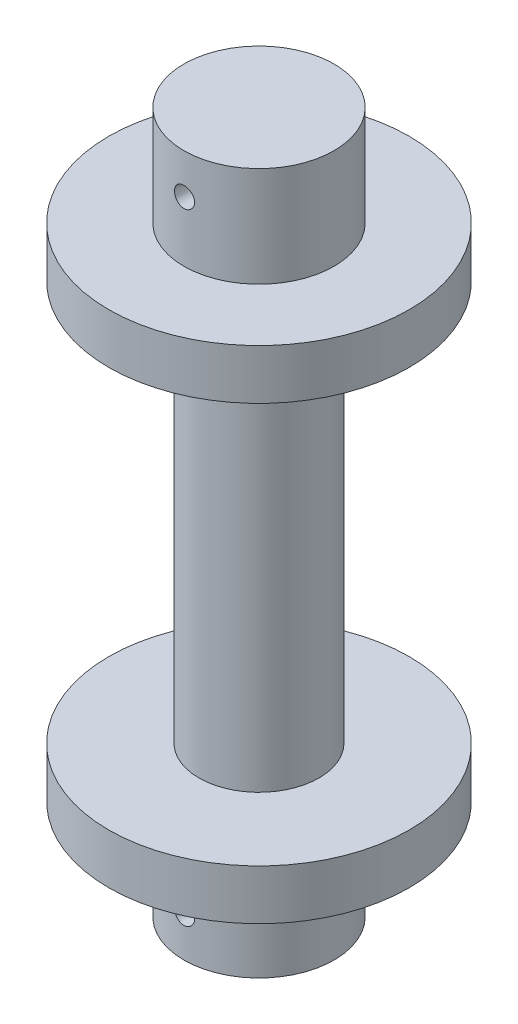
ISO-10303-21;
HEADER;
FILE_DESCRIPTION(('STEP AP214'),'2;1');
FILE_NAME('part.step','',(''),(''),'','','');
FILE_SCHEMA(('AUTOMOTIVE_DESIGN { 1 0 10303 214 1 1 1 1 }'));
ENDSEC;
DATA;
#1=APPLICATION_CONTEXT('core data for automotive mechanical design processes');
#2=APPLICATION_PROTOCOL_DEFINITION('international standard','automotive_design',2000,#1);
#3=PRODUCT_CONTEXT('',#1,'mechanical');
#4=PRODUCT('Part','Part','',(#3));
#5=PRODUCT_RELATED_PRODUCT_CATEGORY('part','',(#4));
#6=PRODUCT_DEFINITION_FORMATION('','',#4);
#7=PRODUCT_DEFINITION_CONTEXT('part definition',#1,'design');
#8=PRODUCT_DEFINITION('design','',#6,#7);
#9=PRODUCT_DEFINITION_SHAPE('','',#8);
#10=(LENGTH_UNIT() NAMED_UNIT(*) SI_UNIT(.MILLI.,.METRE.));
#11=(NAMED_UNIT(*) PLANE_ANGLE_UNIT() SI_UNIT($,.RADIAN.));
#12=(NAMED_UNIT(*) SI_UNIT($,.STERADIAN.) SOLID_ANGLE_UNIT());
#13=UNCERTAINTY_MEASURE_WITH_UNIT(LENGTH_MEASURE(1.E-05),#10,'distance_accuracy_value','');
#14=(GEOMETRIC_REPRESENTATION_CONTEXT(3) GLOBAL_UNCERTAINTY_ASSIGNED_CONTEXT((#13)) GLOBAL_UNIT_ASSIGNED_CONTEXT((#10,
#11,#12)) REPRESENTATION_CONTEXT('',''));
#15=CARTESIAN_POINT('',(0.,0.,0.));
#16=DIRECTION('',(0.,0.,1.));
#17=DIRECTION('',(1.,0.,0.));
#18=AXIS2_PLACEMENT_3D('',#15,#16,#17);
#19=CARTESIAN_POINT('',(0.,10.,0.));
#20=DIRECTION('',(0.,-1.,0.));
#21=DIRECTION('',(0.,0.,-1.));
#22=AXIS2_PLACEMENT_3D('',#19,#20,#21);
#23=CYLINDRICAL_SURFACE('',#22,7.5);
#24=CARTESIAN_POINT('',(0.,5.,-7.5));
#25=CARTESIAN_POINT('',(-0.0559044178346422,4.99999764514654,-7.49999917871272));
#26=CARTESIAN_POINT('',(-0.11184298963814,4.99529623101876,-7.49936835363597));
#27=CARTESIAN_POINT('',(-0.222161362569039,4.97661682547522,-7.49691255563452));
#28=CARTESIAN_POINT('',(-0.276539511166518,4.96262935255143,-7.49508636220862));
#29=CARTESIAN_POINT('',(-0.382124156313492,4.92579914122928,-7.49044539924533));
#30=CARTESIAN_POINT('',(-0.433332841529247,4.90296259448078,-7.48763132105486));
#31=CARTESIAN_POINT('',(-0.53118194751515,4.84909654309686,-7.48132693330196));
#32=CARTESIAN_POINT('',(-0.577823103168513,4.81806835941677,-7.47783673279283));
#33=CARTESIAN_POINT('',(-0.665512911252339,4.74849336919791,-7.47054497394982));
#34=CARTESIAN_POINT('',(-0.706528992747931,4.70990567749576,-7.46674179081055));
#35=CARTESIAN_POINT('',(-0.781523678365509,4.62639490546167,-7.45926568778975));
#36=CARTESIAN_POINT('',(-0.815501909986106,4.5814714900021,-7.45559277481171));
#37=CARTESIAN_POINT('',(-0.875579511344537,4.48635043852748,-7.44877717720095));
#38=CARTESIAN_POINT('',(-0.901648037412889,4.43613315876069,-7.44563658882881));
#39=CARTESIAN_POINT('',(-0.944969225036451,4.33198446638161,-7.44026293689616));
#40=CARTESIAN_POINT('',(-0.96222226622639,4.27805321382334,-7.43802983425604));
#41=CARTESIAN_POINT('',(-0.987323033860869,4.16834709474917,-7.43473968284334));
#42=CARTESIAN_POINT('',(-0.995226021142532,4.11258508273354,-7.43367572685068));
#43=CARTESIAN_POINT('',(-1.00157340274059,4.00051691019702,-7.43282325804657));
#44=CARTESIAN_POINT('',(-1.00001822816801,3.94421077459455,-7.433034687102));
#45=CARTESIAN_POINT('',(-0.987538729696172,3.83303943498604,-7.43470277886495));
#46=CARTESIAN_POINT('',(-0.976675487658808,3.77816723505715,-7.43615132311171));
#47=CARTESIAN_POINT('',(-0.945983623171857,3.67103158161996,-7.44011776387373));
#48=CARTESIAN_POINT('',(-0.926154796307286,3.61876818762249,-7.44263568477064));
#49=CARTESIAN_POINT('',(-0.878029645715955,3.5181451826464,-7.44846630555513));
#50=CARTESIAN_POINT('',(-0.849706989568746,3.46979831440285,-7.45178147061949));
#51=CARTESIAN_POINT('',(-0.785416966721446,3.37852045904117,-7.45883118109967));
#52=CARTESIAN_POINT('',(-0.749449202511925,3.33558975372292,-7.46256574831765));
#53=CARTESIAN_POINT('',(-0.670552450131812,3.25600849370905,-7.47006949616793));
#54=CARTESIAN_POINT('',(-0.627570853513223,3.21941007864884,-7.47383871770599));
#55=CARTESIAN_POINT('',(-0.536047085066704,3.15393897753581,-7.48095961909132));
#56=CARTESIAN_POINT('',(-0.487504897221185,3.12506631373824,-7.48431129773577));
#57=CARTESIAN_POINT('',(-0.386196109865235,3.07586544115263,-7.4902219687179));
#58=CARTESIAN_POINT('',(-0.333427789420615,3.05554073447684,-7.49278063604478));
#59=CARTESIAN_POINT('',(-0.225185462168125,3.02405534051383,-7.49681412952036));
#60=CARTESIAN_POINT('',(-0.169711599771129,3.0128941646803,-7.49828901344964));
#61=CARTESIAN_POINT('',(-0.0580834516628221,3.00012078361444,-7.49998120688428));
#62=CARTESIAN_POINT('',(-0.00193751727352132,2.99843679910826,-7.50020796924523));
#63=CARTESIAN_POINT('',(0.109835808609359,3.00447583206359,-7.49940395769259));
#64=CARTESIAN_POINT('',(0.165463212672832,3.01219862089118,-7.498373214343));
#65=CARTESIAN_POINT('',(0.274406857786469,3.03677232669199,-7.49517587679051));
#66=CARTESIAN_POINT('',(0.327731008256022,3.05358878416107,-7.49301357151461));
#67=CARTESIAN_POINT('',(0.43080254939678,3.09583648296854,-7.48779504627144));
#68=CARTESIAN_POINT('',(0.480549803507819,3.12126805300663,-7.4847387921972));
#69=CARTESIAN_POINT('',(0.575374439308039,3.18019607779166,-7.47804918685037));
#70=CARTESIAN_POINT('',(0.620422907198301,3.21373868285667,-7.47441257522858));
#71=CARTESIAN_POINT('',(0.704276473495948,3.28787166461213,-7.46697864354991));
#72=CARTESIAN_POINT('',(0.743081288311892,3.32846236125822,-7.4631813162031));
#73=CARTESIAN_POINT('',(0.81360274711549,3.41585657131978,-7.45582451236755));
#74=CARTESIAN_POINT('',(0.845271638044691,3.46269878336908,-7.45226674387649));
#75=CARTESIAN_POINT('',(0.900291755394069,3.56107970514046,-7.44582066500909));
#76=CARTESIAN_POINT('',(0.923643167551732,3.61261830995519,-7.44293233968392));
#77=CARTESIAN_POINT('',(0.961289182503731,3.71877862101385,-7.43816405890039));
#78=CARTESIAN_POINT('',(0.975610144233977,3.7733908426054,-7.43628117116299));
#79=CARTESIAN_POINT('',(0.994873335719794,3.88427181606438,-7.43372874349146));
#80=CARTESIAN_POINT('',(0.999816067133909,3.94054047916222,-7.43305913865671));
#81=CARTESIAN_POINT('',(1.00017242903095,4.05266174542675,-7.43301115647724));
#82=CARTESIAN_POINT('',(0.995661095972463,4.10851412048212,-7.4336226114126));
#83=CARTESIAN_POINT('',(0.977396883433446,4.21865893755194,-7.43604591937099));
#84=CARTESIAN_POINT('',(0.963644007416343,4.27295138015099,-7.43785777194415));
#85=CARTESIAN_POINT('',(0.927311551661036,4.37842184162579,-7.44247445136382));
#86=CARTESIAN_POINT('',(0.904736104095206,4.42960130555843,-7.445278813297));
#87=CARTESIAN_POINT('',(0.851406713798686,4.52745794191303,-7.45156522856411));
#88=CARTESIAN_POINT('',(0.820652613152143,4.57413502737802,-7.45504729498301));
#89=CARTESIAN_POINT('',(0.751562242547542,4.6620448249642,-7.46232983591531));
#90=CARTESIAN_POINT('',(0.713170136134505,4.70323347387756,-7.46613252877041));
#91=CARTESIAN_POINT('',(0.630010846749118,4.77861160818077,-7.47360859500832));
#92=CARTESIAN_POINT('',(0.585242170364888,4.81279944937512,-7.47728193784489));
#93=CARTESIAN_POINT('',(0.490376493926411,4.87333356923326,-7.48410317568764));
#94=CARTESIAN_POINT('',(0.440257310371983,4.89964533327762,-7.48724873213445));
#95=CARTESIAN_POINT('',(0.336296204793665,4.94344029927254,-7.49263660329486));
#96=CARTESIAN_POINT('',(0.282458339484945,4.96093295431243,-7.49487988462156));
#97=CARTESIAN_POINT('',(0.19029420404921,4.98247400319259,-7.49767860871633));
#98=CARTESIAN_POINT('',(0.15254554097789,4.98903662176182,-7.49854481817537));
#99=CARTESIAN_POINT('',(0.0765365858080562,4.99780040708274,-7.49970579245385));
#100=CARTESIAN_POINT('',(0.0382762982256203,5.0000016123068,-7.500000562314));
#101=CARTESIAN_POINT('',(0.,5.,-7.5));
#102=B_SPLINE_CURVE_WITH_KNOTS('',3,(#24,#25,#26,#27,#28,#29,#30,#31,#32,#33,#34,#35,#36,#37,
#38,#39,#40,#41,#42,#43,#44,#45,#46,#47,#48,#49,#50,#51,#52,#53,#54,#55,#56,#57,#58,#59,#60,#61,
#62,#63,#64,#65,#66,#67,#68,#69,#70,#71,#72,#73,#74,#75,#76,#77,#78,#79,#80,#81,#82,#83,#84,#85,
#86,#87,#88,#89,#90,#91,#92,#93,#94,#95,#96,#97,#98,#99,#100,#101),.UNSPECIFIED.,.T.,.F.,(4,2,2,
2,2,2,2,2,2,2,2,2,2,2,2,2,2,2,2,2,2,2,2,2,2,2,2,2,2,2,2,2,2,2,2,2,2,2,4),(0.,0.167573425652872,
0.335318215442522,0.502945846413703,0.670546462820173,0.839079892217795,1.00762223952418,
1.17681360755824,1.34599768883102,1.51417677957179,1.6823482046246,1.84942442549022,
2.01650445587925,2.18410791568949,2.35172009221899,2.52065272242425,2.68958583926148,
2.85858810101269,3.02758135195871,3.1952929249603,3.36300042177239,3.53007681698232,
3.69715958751773,3.86521637384942,4.03328079129381,4.20243852267725,4.37159247636524,
4.54025037367727,4.70889924891817,4.87621463748312,5.04352996334373,5.2107670185131,
5.37800730297951,5.54651833917553,5.7150689062558,5.88434763337258,6.05344452496209,
6.16817869523654,6.28291185342719),.UNSPECIFIED.);
#103=CARTESIAN_POINT('',(0.,5.,-7.5));
#104=VERTEX_POINT('',#103);
#105=EDGE_CURVE('E44',#104,#104,#102,.T.);
#106=ORIENTED_EDGE('',*,*,#105,.T.);
#107=EDGE_LOOP('',(#106));
#108=FACE_BOUND('',#107,.T.);
#109=CARTESIAN_POINT('',(1.,4.,7.43303437365925));
#110=CARTESIAN_POINT('',(0.999997642974211,3.94409807226988,7.43303522266631));
#111=CARTESIAN_POINT('',(0.995296633522848,3.88816198345359,7.43367182371829));
#112=CARTESIAN_POINT('',(0.976618981332774,3.77784876884303,7.43614824351763));
#113=CARTESIAN_POINT('',(0.962632848245786,3.72347329754358,7.43798929330704));
#114=CARTESIAN_POINT('',(0.925806555700513,3.61789431588298,7.44266246058434));
#115=CARTESIAN_POINT('',(0.902972651375006,3.56668859419012,7.4454938777722));
#116=CARTESIAN_POINT('',(0.849112824403648,3.46884446214626,7.45182791129731));
#117=CARTESIAN_POINT('',(0.818088216317403,3.42220532053126,7.45533041990363));
#118=CARTESIAN_POINT('',(0.74851685244753,3.33451327266549,7.46263688659337));
#119=CARTESIAN_POINT('',(0.709928411374281,3.29349356716023,7.4664424424659));
#120=CARTESIAN_POINT('',(0.626414614363067,3.21849187727188,7.47391188129393));
#121=CARTESIAN_POINT('',(0.581488933235995,3.18451025426192,7.47757575696696));
#122=CARTESIAN_POINT('',(0.486365862463802,3.12442907914178,7.48436549880109));
#123=CARTESIAN_POINT('',(0.43614921885561,3.09835975535487,7.48748928251119));
#124=CARTESIAN_POINT('',(0.332001908018684,3.0550369179096,7.49282926707925));
#125=CARTESIAN_POINT('',(0.2780713969612,3.03778303381116,7.49504550607303));
#126=CARTESIAN_POINT('',(0.168367687507044,3.01268054520987,7.49830943097799));
#127=CARTESIAN_POINT('',(0.112607361734948,3.00477659249402,7.49936399102537));
#128=CARTESIAN_POINT('',(0.000542501151828074,2.99842669563159,7.5002092398576));
#129=CARTESIAN_POINT('',(-0.0557620093612332,2.99998033113174,7.49999998481415));
#130=CARTESIAN_POINT('',(-0.166940062232885,3.01245736527047,7.49834672058453));
#131=CARTESIAN_POINT('',(-0.221820418680892,3.02332123237282,7.49691055668904));
#132=CARTESIAN_POINT('',(-0.328972061356277,3.05401716351075,7.49297362046144));
#133=CARTESIAN_POINT('',(-0.38124329227092,3.07384941758406,7.49047282557017));
#134=CARTESIAN_POINT('',(-0.481875904212064,3.12198172056091,7.48467409502082));
#135=CARTESIAN_POINT('',(-0.53022492467663,3.15030731159154,7.48137376072939));
#136=CARTESIAN_POINT('',(-0.621505845367393,3.21460362864143,7.4743447520952));
#137=CARTESIAN_POINT('',(-0.664437462933408,3.2505747533139,7.47061605542144));
#138=CARTESIAN_POINT('',(-0.744015030772694,3.32947392417947,7.46311294047831));
#139=CARTESIAN_POINT('',(-0.780609516765106,3.37245388409682,7.459338392122));
#140=CARTESIAN_POINT('',(-0.846073465285955,3.46397296568629,7.45219749384619));
#141=CARTESIAN_POINT('',(-0.874942897181765,3.51251210940148,7.44883114554537));
#142=CARTESIAN_POINT('',(-0.9241414304325,3.61382000017335,7.4428878816717));
#143=CARTESIAN_POINT('',(-0.944466044533533,3.66659095225924,7.44031138107393));
#144=CARTESIAN_POINT('',(-0.97595045022462,3.77483901031919,7.43624737732859));
#145=CARTESIAN_POINT('',(-0.987110746770717,3.83031596701328,7.43475981418081));
#146=CARTESIAN_POINT('',(-0.999880803843635,3.94194566750248,7.43305322505173));
#147=CARTESIAN_POINT('',(-1.00156315549406,3.99808996516627,7.43282455755814));
#148=CARTESIAN_POINT('',(-0.995521440943979,4.10985962805237,7.43363612148349));
#149=CARTESIAN_POINT('',(-0.987797603648882,4.16548500586973,7.43467632202375));
#150=CARTESIAN_POINT('',(-0.963224025185098,4.27441799320281,7.43789960218385));
#151=CARTESIAN_POINT('',(-0.946409751616799,4.32773374650905,7.44007823893825));
#152=CARTESIAN_POINT('',(-0.904169225400626,4.43078945672622,7.44532929507204));
#153=CARTESIAN_POINT('',(-0.878742631046915,4.48052927166186,7.44840174991421));
#154=CARTESIAN_POINT('',(-0.819822032086054,4.57534865522041,7.45511723309759));
#155=CARTESIAN_POINT('',(-0.786280615831502,4.62039852418412,7.45876356894567));
#156=CARTESIAN_POINT('',(-0.712149161563995,4.70425546921854,7.46620571758255));
#157=CARTESIAN_POINT('',(-0.67155881071877,4.74306226807401,7.47000153699967));
#158=CARTESIAN_POINT('',(-0.584163774179118,4.81358827696056,7.47734474327666));
#159=CARTESIAN_POINT('',(-0.537320320466262,4.84525965818581,7.48089035024858));
#160=CARTESIAN_POINT('',(-0.43893622615881,4.90028414108766,7.48730670739152));
#161=CARTESIAN_POINT('',(-0.38739569125685,4.92363742987805,7.49017747274246));
#162=CARTESIAN_POINT('',(-0.281236386261717,4.96128463079406,7.49491282345577));
#163=CARTESIAN_POINT('',(-0.226627392123681,4.97560571454177,7.49678042410392));
#164=CARTESIAN_POINT('',(-0.115753246711599,4.99487024273049,7.49931158343309));
#165=CARTESIAN_POINT('',(-0.0594881810999119,4.99981417135386,7.49997520428063));
#166=CARTESIAN_POINT('',(0.0526349368557939,5.00017413362016,7.50002323624209));
#167=CARTESIAN_POINT('',(0.10849276296094,4.9956637352972,7.49941752456714));
#168=CARTESIAN_POINT('',(0.218648721526176,4.97739947938401,7.4970146660993));
#169=CARTESIAN_POINT('',(0.272946856170523,4.96364563473935,7.49521752097504));
#170=CARTESIAN_POINT('',(0.37842911729443,4.92730897646167,7.49063278321235));
#171=CARTESIAN_POINT('',(0.429614650771955,4.90473018679597,7.48784564204157));
#172=CARTESIAN_POINT('',(0.527482039315437,4.85139222517713,7.48158874697992));
#173=CARTESIAN_POINT('',(0.574163811199582,4.82063290217378,7.47811898048495));
#174=CARTESIAN_POINT('',(0.662073643033368,4.75153665899818,7.47085145604927));
#175=CARTESIAN_POINT('',(0.703258578581999,4.71314510493041,7.46705145149955));
#176=CARTESIAN_POINT('',(0.77862947793608,4.62998846547632,7.45956932448384));
#177=CARTESIAN_POINT('',(0.812813787651155,4.58522187803936,7.45588723005032));
#178=CARTESIAN_POINT('',(0.873343954892478,4.49035802921457,7.4490405494253));
#179=CARTESIAN_POINT('',(0.89965470214564,4.44023820424499,7.44587830880396));
#180=CARTESIAN_POINT('',(0.943447591407442,4.33627576624143,7.4404568329187));
#181=CARTESIAN_POINT('',(0.960939198331794,4.28243721512016,7.43819663011144));
#182=CARTESIAN_POINT('',(0.982477401892939,4.19027586063733,7.43537566912471));
#183=CARTESIAN_POINT('',(0.98903874067909,4.15253086351626,7.4345021431111));
#184=CARTESIAN_POINT('',(0.99780082671583,4.07652924526442,7.43333120737231));
#185=CARTESIAN_POINT('',(1.00000161371131,4.0382726288001,7.43303379239608));
#186=CARTESIAN_POINT('',(1.,4.,7.43303437365925));
#187=B_SPLINE_CURVE_WITH_KNOTS('',3,(#109,#110,#111,#112,#113,#114,#115,#116,#117,#118,#119,
#120,#121,#122,#123,#124,#125,#126,#127,#128,#129,#130,#131,#132,#133,#134,#135,#136,#137,#138,
#139,#140,#141,#142,#143,#144,#145,#146,#147,#148,#149,#150,#151,#152,#153,#154,#155,#156,#157,
#158,#159,#160,#161,#162,#163,#164,#165,#166,#167,#168,#169,#170,#171,#172,#173,#174,#175,#176,
#177,#178,#179,#180,#181,#182,#183,#184,#185,#186),.UNSPECIFIED.,.T.,.F.,(4,2,2,2,2,2,2,2,2,2,2,
2,2,2,2,2,2,2,2,2,2,2,2,2,2,2,2,2,2,2,2,2,2,2,2,2,2,2,4),(0.,0.16756594461955,0.335303423041821,
0.502922531373103,0.670514754163761,0.839057975594805,1.00760984880017,1.17679778261471,
1.34597860627362,1.51415284761382,1.68231961431326,1.84941904333874,2.01652201332237,
2.18413264227024,2.35175201291212,2.52067457533377,2.68959780758443,2.85860963826768,
3.02761215573449,3.19531851289863,3.36302078890669,3.53007342408195,3.69713268808003,
3.86519264070064,4.03326005374208,4.2024225588115,4.37158125836474,4.54022861884065,
4.70886727109971,4.87619854927048,5.04352959309218,5.21078442673995,5.37804234889437,
5.54654371183369,5.71508484203598,5.88436670989948,6.05346651155517,6.16818970471025,
6.28291185219902),.UNSPECIFIED.);
#188=CARTESIAN_POINT('',(1.,4.,7.43303437365925));
#189=VERTEX_POINT('',#188);
#190=EDGE_CURVE('E119',#189,#189,#187,.T.);
#191=ORIENTED_EDGE('',*,*,#190,.T.);
#192=EDGE_LOOP('',(#191));
#193=FACE_BOUND('',#192,.T.);
#194=CARTESIAN_POINT('',(0.,10.,0.));
#195=DIRECTION('',(0.,1.,0.));
#196=DIRECTION('',(0.,0.,1.));
#197=AXIS2_PLACEMENT_3D('',#194,#195,#196);
#198=CIRCLE('',#197,7.5);
#199=CARTESIAN_POINT('',(0.,10.,7.5));
#200=VERTEX_POINT('',#199);
#201=EDGE_CURVE('E59',#200,#200,#198,.T.);
#202=ORIENTED_EDGE('',*,*,#201,.F.);
#203=EDGE_LOOP('',(#202));
#204=FACE_BOUND('',#203,.T.);
#205=CARTESIAN_POINT('',(0.,0.,0.));
#206=DIRECTION('',(0.,1.,0.));
#207=DIRECTION('',(0.,0.,1.));
#208=AXIS2_PLACEMENT_3D('',#205,#206,#207);
#209=CIRCLE('',#208,7.5);
#210=CARTESIAN_POINT('',(0.,0.,7.5));
#211=VERTEX_POINT('',#210);
#212=EDGE_CURVE('E81',#211,#211,#209,.T.);
#213=ORIENTED_EDGE('',*,*,#212,.T.);
#214=EDGE_LOOP('',(#213));
#215=FACE_BOUND('',#214,.T.);
#216=ADVANCED_FACE('F40',(#108,#193,#204,#215),#23,.T.);
#217=CARTESIAN_POINT('',(0.,0.,0.));
#218=DIRECTION('',(0.,1.,0.));
#219=DIRECTION('',(0.,0.,1.));
#220=AXIS2_PLACEMENT_3D('',#217,#218,#219);
#221=PLANE('',#220);
#222=ORIENTED_EDGE('',*,*,#212,.F.);
#223=EDGE_LOOP('',(#222));
#224=FACE_BOUND('',#223,.T.);
#225=ADVANCED_FACE('F148',(#224),#221,.F.);
#226=CARTESIAN_POINT('',(0.,15.,0.));
#227=DIRECTION('',(0.,-1.,0.));
#228=DIRECTION('',(0.,0.,-1.));
#229=AXIS2_PLACEMENT_3D('',#226,#227,#228);
#230=CYLINDRICAL_SURFACE('',#229,15.);
#231=CARTESIAN_POINT('',(0.,15.,0.));
#232=DIRECTION('',(0.,1.,0.));
#233=DIRECTION('',(0.,0.,1.));
#234=AXIS2_PLACEMENT_3D('',#231,#232,#233);
#235=CIRCLE('',#234,15.);
#236=CARTESIAN_POINT('',(0.,15.,15.));
#237=VERTEX_POINT('',#236);
#238=EDGE_CURVE('E77',#237,#237,#235,.T.);
#239=ORIENTED_EDGE('',*,*,#238,.F.);
#240=EDGE_LOOP('',(#239));
#241=FACE_BOUND('',#240,.T.);
#242=CARTESIAN_POINT('',(0.,10.,0.));
#243=DIRECTION('',(0.,1.,0.));
#244=DIRECTION('',(0.,0.,1.));
#245=AXIS2_PLACEMENT_3D('',#242,#243,#244);
#246=CIRCLE('',#245,15.);
#247=CARTESIAN_POINT('',(0.,10.,15.));
#248=VERTEX_POINT('',#247);
#249=EDGE_CURVE('E75',#248,#248,#246,.T.);
#250=ORIENTED_EDGE('',*,*,#249,.T.);
#251=EDGE_LOOP('',(#250));
#252=FACE_BOUND('',#251,.T.);
#253=ADVANCED_FACE('F153',(#241,#252),#230,.T.);
#254=CARTESIAN_POINT('',(0.,15.,0.));
#255=DIRECTION('',(0.,1.,0.));
#256=DIRECTION('',(0.,0.,1.));
#257=AXIS2_PLACEMENT_3D('',#254,#255,#256);
#258=PLANE('',#257);
#259=CARTESIAN_POINT('',(0.,15.,0.));
#260=DIRECTION('',(0.,1.,0.));
#261=DIRECTION('',(0.,0.,1.));
#262=AXIS2_PLACEMENT_3D('',#259,#260,#261);
#263=CIRCLE('',#262,6.);
#264=CARTESIAN_POINT('',(0.,15.,6.));
#265=VERTEX_POINT('',#264);
#266=EDGE_CURVE('E53',#265,#265,#263,.T.);
#267=ORIENTED_EDGE('',*,*,#266,.F.);
#268=EDGE_LOOP('',(#267));
#269=FACE_BOUND('',#268,.T.);
#270=ORIENTED_EDGE('',*,*,#238,.T.);
#271=EDGE_LOOP('',(#270));
#272=FACE_BOUND('',#271,.T.);
#273=ADVANCED_FACE('F165',(#269,#272),#258,.T.);
#274=CARTESIAN_POINT('',(0.,10.,0.));
#275=DIRECTION('',(0.,1.,0.));
#276=DIRECTION('',(0.,0.,1.));
#277=AXIS2_PLACEMENT_3D('',#274,#275,#276);
#278=PLANE('',#277);
#279=ORIENTED_EDGE('',*,*,#201,.T.);
#280=EDGE_LOOP('',(#279));
#281=FACE_BOUND('',#280,.T.);
#282=ORIENTED_EDGE('',*,*,#249,.F.);
#283=EDGE_LOOP('',(#282));
#284=FACE_BOUND('',#283,.T.);
#285=ADVANCED_FACE('F161',(#281,#284),#278,.F.);
#286=CARTESIAN_POINT('',(0.,55.,0.));
#287=DIRECTION('',(0.,-1.,0.));
#288=DIRECTION('',(0.,0.,-1.));
#289=AXIS2_PLACEMENT_3D('',#286,#287,#288);
#290=CYLINDRICAL_SURFACE('',#289,6.);
#291=CARTESIAN_POINT('',(0.,55.,0.));
#292=DIRECTION('',(0.,1.,0.));
#293=DIRECTION('',(0.,0.,1.));
#294=AXIS2_PLACEMENT_3D('',#291,#292,#293);
#295=CIRCLE('',#294,6.);
#296=CARTESIAN_POINT('',(0.,55.,6.));
#297=VERTEX_POINT('',#296);
#298=EDGE_CURVE('E68',#297,#297,#295,.T.);
#299=ORIENTED_EDGE('',*,*,#298,.F.);
#300=EDGE_LOOP('',(#299));
#301=FACE_BOUND('',#300,.T.);
#302=ORIENTED_EDGE('',*,*,#266,.T.);
#303=EDGE_LOOP('',(#302));
#304=FACE_BOUND('',#303,.T.);
#305=ADVANCED_FACE('F164',(#301,#304),#290,.T.);
#306=CARTESIAN_POINT('',(0.,60.,0.));
#307=DIRECTION('',(0.,-1.,0.));
#308=DIRECTION('',(0.,0.,-1.));
#309=AXIS2_PLACEMENT_3D('',#306,#307,#308);
#310=CYLINDRICAL_SURFACE('',#309,15.);
#311=CARTESIAN_POINT('',(0.,60.,0.));
#312=DIRECTION('',(0.,1.,0.));
#313=DIRECTION('',(0.,0.,1.));
#314=AXIS2_PLACEMENT_3D('',#311,#312,#313);
#315=CIRCLE('',#314,15.);
#316=CARTESIAN_POINT('',(0.,60.,15.));
#317=VERTEX_POINT('',#316);
#318=EDGE_CURVE('E64',#317,#317,#315,.T.);
#319=ORIENTED_EDGE('',*,*,#318,.F.);
#320=EDGE_LOOP('',(#319));
#321=FACE_BOUND('',#320,.T.);
#322=CARTESIAN_POINT('',(0.,55.,0.));
#323=DIRECTION('',(0.,1.,0.));
#324=DIRECTION('',(0.,0.,1.));
#325=AXIS2_PLACEMENT_3D('',#322,#323,#324);
#326=CIRCLE('',#325,15.);
#327=CARTESIAN_POINT('',(0.,55.,15.));
#328=VERTEX_POINT('',#327);
#329=EDGE_CURVE('E69',#328,#328,#326,.T.);
#330=ORIENTED_EDGE('',*,*,#329,.T.);
#331=EDGE_LOOP('',(#330));
#332=FACE_BOUND('',#331,.T.);
#333=ADVANCED_FACE('F181',(#321,#332),#310,.T.);
#334=CARTESIAN_POINT('',(0.,60.,0.));
#335=DIRECTION('',(0.,1.,0.));
#336=DIRECTION('',(0.,0.,1.));
#337=AXIS2_PLACEMENT_3D('',#334,#335,#336);
#338=PLANE('',#337);
#339=CARTESIAN_POINT('',(0.,60.,0.));
#340=DIRECTION('',(0.,1.,0.));
#341=DIRECTION('',(0.,0.,1.));
#342=AXIS2_PLACEMENT_3D('',#339,#340,#341);
#343=CIRCLE('',#342,7.5);
#344=CARTESIAN_POINT('',(0.,60.,7.5));
#345=VERTEX_POINT('',#344);
#346=EDGE_CURVE('E10',#345,#345,#343,.T.);
#347=ORIENTED_EDGE('',*,*,#346,.F.);
#348=EDGE_LOOP('',(#347));
#349=FACE_BOUND('',#348,.T.);
#350=ORIENTED_EDGE('',*,*,#318,.T.);
#351=EDGE_LOOP('',(#350));
#352=FACE_BOUND('',#351,.T.);
#353=ADVANCED_FACE('F185',(#349,#352),#338,.T.);
#354=CARTESIAN_POINT('',(0.,55.,0.));
#355=DIRECTION('',(0.,1.,0.));
#356=DIRECTION('',(0.,0.,1.));
#357=AXIS2_PLACEMENT_3D('',#354,#355,#356);
#358=PLANE('',#357);
#359=ORIENTED_EDGE('',*,*,#298,.T.);
#360=EDGE_LOOP('',(#359));
#361=FACE_BOUND('',#360,.T.);
#362=ORIENTED_EDGE('',*,*,#329,.F.);
#363=EDGE_LOOP('',(#362));
#364=FACE_BOUND('',#363,.T.);
#365=ADVANCED_FACE('F136',(#361,#364),#358,.F.);
#366=CARTESIAN_POINT('',(0.,70.,0.));
#367=DIRECTION('',(0.,-1.,0.));
#368=DIRECTION('',(0.,0.,-1.));
#369=AXIS2_PLACEMENT_3D('',#366,#367,#368);
#370=CYLINDRICAL_SURFACE('',#369,7.5);
#371=CARTESIAN_POINT('',(0.,67.,-7.5));
#372=CARTESIAN_POINT('',(-0.0559044178346421,66.9999976451465,-7.49999917871272));
#373=CARTESIAN_POINT('',(-0.11184298963814,66.9952962310188,-7.49936835363597));
#374=CARTESIAN_POINT('',(-0.222161362569039,66.9766168254752,-7.49691255563452));
#375=CARTESIAN_POINT('',(-0.276539511166518,66.9626293525514,-7.49508636220862));
#376=CARTESIAN_POINT('',(-0.382124156313493,66.9257991412293,-7.49044539924533));
#377=CARTESIAN_POINT('',(-0.43333284152925,66.9029625944808,-7.48763132105486));
#378=CARTESIAN_POINT('',(-0.531181947515151,66.8490965430969,-7.48132693330196));
#379=CARTESIAN_POINT('',(-0.577823103168512,66.8180683594168,-7.47783673279283));
#380=CARTESIAN_POINT('',(-0.665512911252338,66.7484933691979,-7.47054497394982));
#381=CARTESIAN_POINT('',(-0.706528992747933,66.7099056774958,-7.46674179081055));
#382=CARTESIAN_POINT('',(-0.781523678365512,66.6263949054617,-7.45926568778975));
#383=CARTESIAN_POINT('',(-0.815501909986109,66.5814714900021,-7.45559277481171));
#384=CARTESIAN_POINT('',(-0.875579511344542,66.4863504385275,-7.44877717720095));
#385=CARTESIAN_POINT('',(-0.901648037412897,66.4361331587607,-7.44563658882881));
#386=CARTESIAN_POINT('',(-0.944969225036456,66.3319844663816,-7.44026293689616));
#387=CARTESIAN_POINT('',(-0.962222266226392,66.2780532138233,-7.43802983425604));
#388=CARTESIAN_POINT('',(-0.987323033860869,66.1683470947492,-7.43473968284334));
#389=CARTESIAN_POINT('',(-0.995226021142532,66.1125850827335,-7.43367572685068));
#390=CARTESIAN_POINT('',(-1.00157340274059,66.000516910197,-7.43282325804657));
#391=CARTESIAN_POINT('',(-1.00001822816801,65.9442107745945,-7.433034687102));
#392=CARTESIAN_POINT('',(-0.987538729696173,65.833039434986,-7.43470277886495));
#393=CARTESIAN_POINT('',(-0.976675487658809,65.7781672350571,-7.43615132311171));
#394=CARTESIAN_POINT('',(-0.945983623171858,65.67103158162,-7.44011776387373));
#395=CARTESIAN_POINT('',(-0.926154796307287,65.6187681876225,-7.44263568477064));
#396=CARTESIAN_POINT('',(-0.878029645715957,65.5181451826464,-7.44846630555513));
#397=CARTESIAN_POINT('',(-0.849706989568747,65.4697983144029,-7.45178147061949));
#398=CARTESIAN_POINT('',(-0.785416966721446,65.3785204590412,-7.45883118109967));
#399=CARTESIAN_POINT('',(-0.749449202511925,65.3355897537229,-7.46256574831765));
#400=CARTESIAN_POINT('',(-0.67055245013181,65.256008493709,-7.47006949616793));
#401=CARTESIAN_POINT('',(-0.627570853513221,65.2194100786488,-7.47383871770599));
#402=CARTESIAN_POINT('',(-0.536047085066702,65.1539389775358,-7.48095961909132));
#403=CARTESIAN_POINT('',(-0.487504897221184,65.1250663137382,-7.48431129773577));
#404=CARTESIAN_POINT('',(-0.386196109865235,65.0758654411526,-7.4902219687179));
#405=CARTESIAN_POINT('',(-0.333427789420614,65.0555407344768,-7.49278063604478));
#406=CARTESIAN_POINT('',(-0.225185462168124,65.0240553405138,-7.49681412952036));
#407=CARTESIAN_POINT('',(-0.169711599771129,65.0128941646803,-7.49828901344964));
#408=CARTESIAN_POINT('',(-0.0580834516628238,65.0001207836144,-7.49998120688428));
#409=CARTESIAN_POINT('',(-0.00193751727352265,64.9984367991083,-7.50020796924523));
#410=CARTESIAN_POINT('',(0.109835808609358,65.0044758320636,-7.49940395769259));
#411=CARTESIAN_POINT('',(0.165463212672832,65.0121986208912,-7.49837321434299));
#412=CARTESIAN_POINT('',(0.27440685778647,65.036772326692,-7.4951758767905));
#413=CARTESIAN_POINT('',(0.327731008256023,65.0535887841611,-7.49301357151461));
#414=CARTESIAN_POINT('',(0.43080254939678,65.0958364829685,-7.48779504627144));
#415=CARTESIAN_POINT('',(0.480549803507818,65.1212680530066,-7.4847387921972));
#416=CARTESIAN_POINT('',(0.575374439308041,65.1801960777916,-7.47804918685037));
#417=CARTESIAN_POINT('',(0.620422907198306,65.2137386828567,-7.47441257522858));
#418=CARTESIAN_POINT('',(0.704276473495954,65.2878716646121,-7.46697864354991));
#419=CARTESIAN_POINT('',(0.743081288311897,65.3284623612582,-7.4631813162031));
#420=CARTESIAN_POINT('',(0.813602747115493,65.4158565713198,-7.45582451236755));
#421=CARTESIAN_POINT('',(0.845271638044693,65.4626987833691,-7.45226674387649));
#422=CARTESIAN_POINT('',(0.900291755394071,65.5610797051405,-7.44582066500909));
#423=CARTESIAN_POINT('',(0.923643167551735,65.6126183099552,-7.44293233968392));
#424=CARTESIAN_POINT('',(0.961289182503735,65.7187786210138,-7.43816405890039));
#425=CARTESIAN_POINT('',(0.975610144233981,65.7733908426054,-7.43628117116299));
#426=CARTESIAN_POINT('',(0.994873335719796,65.8842718160644,-7.43372874349146));
#427=CARTESIAN_POINT('',(0.99981606713391,65.9405404791622,-7.43305913865671));
#428=CARTESIAN_POINT('',(1.00017242903095,66.0526617454267,-7.43301115647724));
#429=CARTESIAN_POINT('',(0.995661095972462,66.1085141204821,-7.4336226114126));
#430=CARTESIAN_POINT('',(0.977396883433445,66.2186589375519,-7.43604591937099));
#431=CARTESIAN_POINT('',(0.963644007416345,66.272951380151,-7.43785777194415));
#432=CARTESIAN_POINT('',(0.92731155166104,66.3784218416258,-7.44247445136382));
#433=CARTESIAN_POINT('',(0.904736104095208,66.4296013055584,-7.445278813297));
#434=CARTESIAN_POINT('',(0.851406713798689,66.527457941913,-7.45156522856411));
#435=CARTESIAN_POINT('',(0.820652613152148,66.574135027378,-7.45504729498301));
#436=CARTESIAN_POINT('',(0.751562242547546,66.6620448249642,-7.46232983591531));
#437=CARTESIAN_POINT('',(0.713170136134506,66.7032334738775,-7.46613252877041));
#438=CARTESIAN_POINT('',(0.63001084674912,66.7786116081808,-7.47360859500832));
#439=CARTESIAN_POINT('',(0.585242170364894,66.8127994493751,-7.47728193784489));
#440=CARTESIAN_POINT('',(0.490376493926419,66.8733335692333,-7.48410317568764));
#441=CARTESIAN_POINT('',(0.440257310371989,66.8996453332776,-7.48724873213445));
#442=CARTESIAN_POINT('',(0.336296204793669,66.9434402992725,-7.49263660329486));
#443=CARTESIAN_POINT('',(0.28245833948495,66.9609329543124,-7.49487988462156));
#444=CARTESIAN_POINT('',(0.190294204049214,66.9824740031926,-7.49767860871633));
#445=CARTESIAN_POINT('',(0.152545540977893,66.9890366217618,-7.49854481817537));
#446=CARTESIAN_POINT('',(0.0765365858080574,66.9978004070827,-7.49970579245385));
#447=CARTESIAN_POINT('',(0.0382762982256209,67.0000016123068,-7.500000562314));
#448=CARTESIAN_POINT('',(0.,67.,-7.5));
#449=B_SPLINE_CURVE_WITH_KNOTS('',3,(#371,#372,#373,#374,#375,#376,#377,#378,#379,#380,#381,
#382,#383,#384,#385,#386,#387,#388,#389,#390,#391,#392,#393,#394,#395,#396,#397,#398,#399,#400,
#401,#402,#403,#404,#405,#406,#407,#408,#409,#410,#411,#412,#413,#414,#415,#416,#417,#418,#419,
#420,#421,#422,#423,#424,#425,#426,#427,#428,#429,#430,#431,#432,#433,#434,#435,#436,#437,#438,
#439,#440,#441,#442,#443,#444,#445,#446,#447,#448),.UNSPECIFIED.,.T.,.F.,(4,2,2,2,2,2,2,2,2,2,2,
2,2,2,2,2,2,2,2,2,2,2,2,2,2,2,2,2,2,2,2,2,2,2,2,2,2,2,4),(0.,0.167573425652872,0.33531821544252,
0.502945846413705,0.670546462820174,0.839079892217797,1.00762223952419,1.17681360755827,
1.34599768883103,1.51417677957179,1.6823482046246,1.84942442549021,2.01650445587924,
2.18410791568948,2.35172009221899,2.52065272242425,2.68958583926148,2.85858810101269,
3.02758135195871,3.1952929249603,3.36300042177239,3.53007681698231,3.69715958751773,
3.86521637384942,4.03328079129381,4.20243852267726,4.37159247636524,4.54025037367728,
4.70889924891817,4.87621463748313,5.04352996334372,5.2107670185131,5.37800730297951,
5.54651833917553,5.71506890625579,5.88434763337257,6.05344452496209,6.16817869523654,
6.28291185342719),.UNSPECIFIED.);
#450=CARTESIAN_POINT('',(0.,67.,-7.5));
#451=VERTEX_POINT('',#450);
#452=EDGE_CURVE('E100',#451,#451,#449,.T.);
#453=ORIENTED_EDGE('',*,*,#452,.T.);
#454=EDGE_LOOP('',(#453));
#455=FACE_BOUND('',#454,.T.);
#456=CARTESIAN_POINT('',(1.,66.,7.43303437365925));
#457=CARTESIAN_POINT('',(0.999997642974211,65.9440980722699,7.43303522266631));
#458=CARTESIAN_POINT('',(0.995296633522849,65.8881619834536,7.43367182371829));
#459=CARTESIAN_POINT('',(0.976618981332774,65.777848768843,7.43614824351763));
#460=CARTESIAN_POINT('',(0.962632848245786,65.7234732975436,7.43798929330704));
#461=CARTESIAN_POINT('',(0.925806555700515,65.617894315883,7.44266246058434));
#462=CARTESIAN_POINT('',(0.902972651375011,65.5666885941901,7.4454938777722));
#463=CARTESIAN_POINT('',(0.849112824403653,65.4688444621463,7.45182791129731));
#464=CARTESIAN_POINT('',(0.818088216317406,65.4222053205312,7.45533041990363));
#465=CARTESIAN_POINT('',(0.748516852447531,65.3345132726655,7.46263688659337));
#466=CARTESIAN_POINT('',(0.709928411374285,65.2934935671602,7.4664424424659));
#467=CARTESIAN_POINT('',(0.626414614363072,65.2184918772719,7.47391188129393));
#468=CARTESIAN_POINT('',(0.581488933236,65.1845102542619,7.47757575696696));
#469=CARTESIAN_POINT('',(0.486365862463807,65.1244290791418,7.48436549880108));
#470=CARTESIAN_POINT('',(0.436149218855616,65.0983597553549,7.48748928251119));
#471=CARTESIAN_POINT('',(0.33200190801869,65.0550369179096,7.49282926707925));
#472=CARTESIAN_POINT('',(0.278071396961204,65.0377830338112,7.49504550607303));
#473=CARTESIAN_POINT('',(0.168367687507045,65.0126805452098,7.49830943097799));
#474=CARTESIAN_POINT('',(0.112607361734949,65.004776592494,7.49936399102537));
#475=CARTESIAN_POINT('',(0.000542501151828169,64.9984266956316,7.5002092398576));
#476=CARTESIAN_POINT('',(-0.0557620093612333,64.9999803311317,7.49999998481415));
#477=CARTESIAN_POINT('',(-0.166940062232884,65.0124573652705,7.49834672058453));
#478=CARTESIAN_POINT('',(-0.221820418680891,65.0233212323728,7.49691055668904));
#479=CARTESIAN_POINT('',(-0.328972061356276,65.0540171635107,7.49297362046144));
#480=CARTESIAN_POINT('',(-0.381243292270918,65.0738494175841,7.49047282557017));
#481=CARTESIAN_POINT('',(-0.481875904212064,65.1219817205609,7.48467409502082));
#482=CARTESIAN_POINT('',(-0.53022492467663,65.1503073115915,7.48137376072939));
#483=CARTESIAN_POINT('',(-0.621505845367395,65.2146036286414,7.4743447520952));
#484=CARTESIAN_POINT('',(-0.66443746293341,65.2505747533139,7.47061605542144));
#485=CARTESIAN_POINT('',(-0.744015030772693,65.3294739241795,7.46311294047831));
#486=CARTESIAN_POINT('',(-0.780609516765102,65.3724538840968,7.459338392122));
#487=CARTESIAN_POINT('',(-0.846073465285951,65.4639729656863,7.45219749384619));
#488=CARTESIAN_POINT('',(-0.874942897181762,65.5125121094015,7.44883114554537));
#489=CARTESIAN_POINT('',(-0.924141430432498,65.6138200001733,7.4428878816717));
#490=CARTESIAN_POINT('',(-0.944466044533531,65.6665909522592,7.44031138107393));
#491=CARTESIAN_POINT('',(-0.975950450224619,65.7748390103192,7.43624737732859));
#492=CARTESIAN_POINT('',(-0.987110746770717,65.8303159670133,7.43475981418081));
#493=CARTESIAN_POINT('',(-0.999880803843635,65.9419456675025,7.43305322505173));
#494=CARTESIAN_POINT('',(-1.00156315549406,65.9980899651663,7.43282455755814));
#495=CARTESIAN_POINT('',(-0.995521440943979,66.1098596280523,7.43363612148349));
#496=CARTESIAN_POINT('',(-0.987797603648882,66.1654850058697,7.43467632202375));
#497=CARTESIAN_POINT('',(-0.963224025185099,66.2744179932028,7.43789960218385));
#498=CARTESIAN_POINT('',(-0.946409751616799,66.3277337465091,7.44007823893825));
#499=CARTESIAN_POINT('',(-0.904169225400624,66.4307894567262,7.44532929507204));
#500=CARTESIAN_POINT('',(-0.878742631046913,66.4805292716619,7.44840174991421));
#501=CARTESIAN_POINT('',(-0.819822032086053,66.5753486552204,7.45511723309759));
#502=CARTESIAN_POINT('',(-0.786280615831501,66.6203985241841,7.45876356894567));
#503=CARTESIAN_POINT('',(-0.712149161563993,66.7042554692185,7.46620571758255));
#504=CARTESIAN_POINT('',(-0.671558810718768,66.743062268074,7.47000153699967));
#505=CARTESIAN_POINT('',(-0.584163774179118,66.8135882769605,7.47734474327666));
#506=CARTESIAN_POINT('',(-0.537320320466262,66.8452596581858,7.48089035024858));
#507=CARTESIAN_POINT('',(-0.43893622615881,66.9002841410877,7.48730670739152));
#508=CARTESIAN_POINT('',(-0.38739569125685,66.923637429878,7.49017747274246));
#509=CARTESIAN_POINT('',(-0.281236386261718,66.9612846307941,7.49491282345577));
#510=CARTESIAN_POINT('',(-0.226627392123684,66.9756057145418,7.49678042410392));
#511=CARTESIAN_POINT('',(-0.115753246711603,66.9948702427305,7.49931158343309));
#512=CARTESIAN_POINT('',(-0.0594881810999154,66.9998141713538,7.49997520428063));
#513=CARTESIAN_POINT('',(0.0526349368557919,67.0001741336201,7.50002323624209));
#514=CARTESIAN_POINT('',(0.108492762960939,66.9956637352972,7.49941752456714));
#515=CARTESIAN_POINT('',(0.218648721526177,66.977399479384,7.4970146660993));
#516=CARTESIAN_POINT('',(0.272946856170525,66.9636456347394,7.49521752097504));
#517=CARTESIAN_POINT('',(0.378429117294432,66.9273089764617,7.49063278321235));
#518=CARTESIAN_POINT('',(0.429614650771957,66.904730186796,7.48784564204157));
#519=CARTESIAN_POINT('',(0.527482039315437,66.8513922251771,7.48158874697992));
#520=CARTESIAN_POINT('',(0.574163811199583,66.8206329021738,7.47811898048495));
#521=CARTESIAN_POINT('',(0.662073643033369,66.7515366589982,7.47085145604927));
#522=CARTESIAN_POINT('',(0.703258578582,66.7131451049304,7.46705145149955));
#523=CARTESIAN_POINT('',(0.778629477936082,66.6299884654763,7.45956932448384));
#524=CARTESIAN_POINT('',(0.812813787651158,66.5852218780393,7.45588723005032));
#525=CARTESIAN_POINT('',(0.87334395489248,66.4903580292145,7.4490405494253));
#526=CARTESIAN_POINT('',(0.899654702145643,66.440238204245,7.44587830880396));
#527=CARTESIAN_POINT('',(0.943447591407444,66.3362757662414,7.4404568329187));
#528=CARTESIAN_POINT('',(0.960939198331794,66.2824372151202,7.43819663011144));
#529=CARTESIAN_POINT('',(0.982477401892938,66.1902758606373,7.43537566912471));
#530=CARTESIAN_POINT('',(0.98903874067909,66.1525308635162,7.4345021431111));
#531=CARTESIAN_POINT('',(0.99780082671583,66.0765292452644,7.43333120737231));
#532=CARTESIAN_POINT('',(1.00000161371131,66.0382726288001,7.43303379239608));
#533=CARTESIAN_POINT('',(1.,66.,7.43303437365925));
#534=B_SPLINE_CURVE_WITH_KNOTS('',3,(#456,#457,#458,#459,#460,#461,#462,#463,#464,#465,#466,
#467,#468,#469,#470,#471,#472,#473,#474,#475,#476,#477,#478,#479,#480,#481,#482,#483,#484,#485,
#486,#487,#488,#489,#490,#491,#492,#493,#494,#495,#496,#497,#498,#499,#500,#501,#502,#503,#504,
#505,#506,#507,#508,#509,#510,#511,#512,#513,#514,#515,#516,#517,#518,#519,#520,#521,#522,#523,
#524,#525,#526,#527,#528,#529,#530,#531,#532,#533),.UNSPECIFIED.,.T.,.F.,(4,2,2,2,2,2,2,2,2,2,2,
2,2,2,2,2,2,2,2,2,2,2,2,2,2,2,2,2,2,2,2,2,2,2,2,2,2,2,4),(0.,0.167565944619552,
0.335303423041822,0.502922531373099,0.670514754163761,0.839057975594799,1.00760984880016,
1.17679778261471,1.34597860627362,1.51415284761383,1.68231961431326,1.84941904333874,
2.01652201332238,2.18413264227024,2.35175201291212,2.52067457533376,2.68959780758443,
2.85860963826769,3.0276121557345,3.19531851289863,3.36302078890669,3.53007342408197,
3.69713268808004,3.86519264070066,4.03326005374209,4.2024225588115,4.37158125836474,
4.54022861884066,4.70886727109971,4.87619854927049,5.04352959309219,5.21078442673996,
5.37804234889437,5.54654371183369,5.715084842036,5.88436670989948,6.05346651155518,
6.16818970471025,6.28291185219903),.UNSPECIFIED.);
#535=CARTESIAN_POINT('',(1.,66.,7.43303437365925));
#536=VERTEX_POINT('',#535);
#537=EDGE_CURVE('E91',#536,#536,#534,.T.);
#538=ORIENTED_EDGE('',*,*,#537,.T.);
#539=EDGE_LOOP('',(#538));
#540=FACE_BOUND('',#539,.T.);
#541=CARTESIAN_POINT('',(0.,70.,0.));
#542=DIRECTION('',(0.,1.,0.));
#543=DIRECTION('',(0.,0.,1.));
#544=AXIS2_PLACEMENT_3D('',#541,#542,#543);
#545=CIRCLE('',#544,7.5);
#546=CARTESIAN_POINT('',(0.,70.,7.5));
#547=VERTEX_POINT('',#546);
#548=EDGE_CURVE('E63',#547,#547,#545,.T.);
#549=ORIENTED_EDGE('',*,*,#548,.F.);
#550=EDGE_LOOP('',(#549));
#551=FACE_BOUND('',#550,.T.);
#552=ORIENTED_EDGE('',*,*,#346,.T.);
#553=EDGE_LOOP('',(#552));
#554=FACE_BOUND('',#553,.T.);
#555=ADVANCED_FACE('F104',(#455,#540,#551,#554),#370,.T.);
#556=CARTESIAN_POINT('',(0.,70.,0.));
#557=DIRECTION('',(0.,1.,0.));
#558=DIRECTION('',(0.,0.,1.));
#559=AXIS2_PLACEMENT_3D('',#556,#557,#558);
#560=PLANE('',#559);
#561=ORIENTED_EDGE('',*,*,#548,.T.);
#562=EDGE_LOOP('',(#561));
#563=FACE_BOUND('',#562,.T.);
#564=ADVANCED_FACE('F112',(#563),#560,.T.);
#565=CARTESIAN_POINT('',(0.,66.,-15.));
#566=DIRECTION('',(0.,0.,1.));
#567=DIRECTION('',(1.,0.,0.));
#568=AXIS2_PLACEMENT_3D('',#565,#566,#567);
#569=CYLINDRICAL_SURFACE('',#568,1.);
#570=ORIENTED_EDGE('',*,*,#537,.F.);
#571=EDGE_LOOP('',(#570));
#572=FACE_BOUND('',#571,.T.);
#573=ORIENTED_EDGE('',*,*,#452,.F.);
#574=EDGE_LOOP('',(#573));
#575=FACE_BOUND('',#574,.T.);
#576=ADVANCED_FACE('F108',(#572,#575),#569,.F.);
#577=CARTESIAN_POINT('',(0.,4.,-15.));
#578=DIRECTION('',(0.,0.,1.));
#579=DIRECTION('',(1.,0.,0.));
#580=AXIS2_PLACEMENT_3D('',#577,#578,#579);
#581=CYLINDRICAL_SURFACE('',#580,1.);
#582=ORIENTED_EDGE('',*,*,#190,.F.);
#583=EDGE_LOOP('',(#582));
#584=FACE_BOUND('',#583,.T.);
#585=ORIENTED_EDGE('',*,*,#105,.F.);
#586=EDGE_LOOP('',(#585));
#587=FACE_BOUND('',#586,.T.);
#588=ADVANCED_FACE('F111',(#584,#587),#581,.F.);
#589=CLOSED_SHELL('',(#216,#225,#253,#273,#285,#305,#333,#353,#365,#555,#564,#576,#588));
#590=MANIFOLD_SOLID_BREP('B2',#589);
#591=ADVANCED_BREP_SHAPE_REPRESENTATION('',(#18,#590),#14);
#592=SHAPE_DEFINITION_REPRESENTATION(#9,#591);
ENDSEC;
END-ISO-10303-21;
